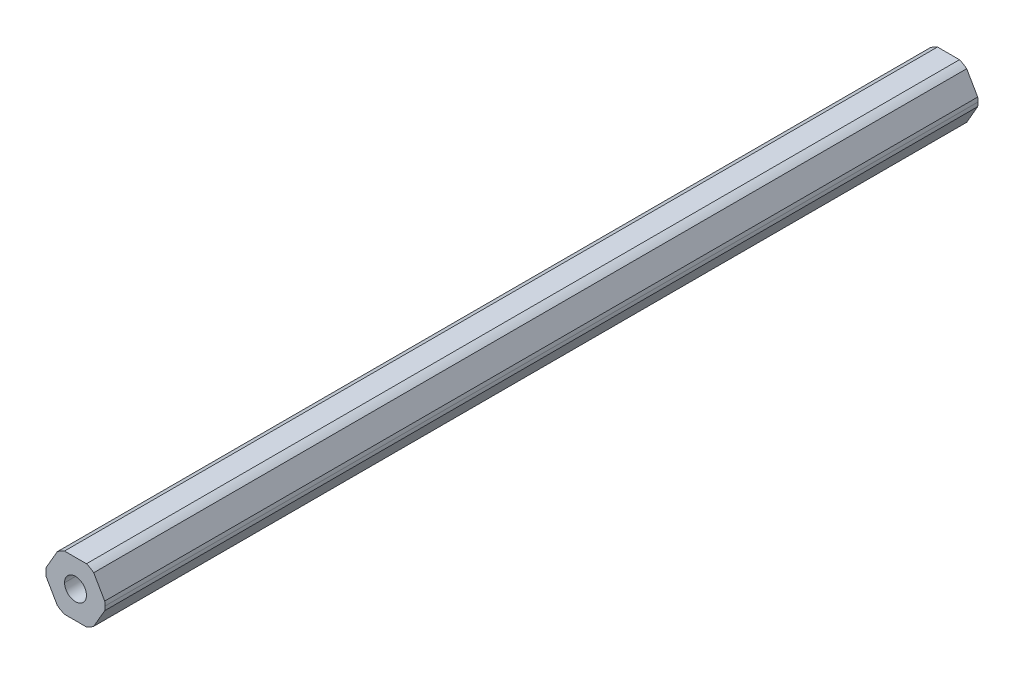
ISO-10303-21;
HEADER;
FILE_DESCRIPTION(('STEP AP214'),'2;1');
FILE_NAME('part.step','',(''),(''),'','','');
FILE_SCHEMA(('AUTOMOTIVE_DESIGN { 1 0 10303 214 1 1 1 1 }'));
ENDSEC;
DATA;
#1=APPLICATION_CONTEXT('core data for automotive mechanical design processes');
#2=APPLICATION_PROTOCOL_DEFINITION('international standard','automotive_design',2000,#1);
#3=PRODUCT_CONTEXT('',#1,'mechanical');
#4=PRODUCT('Part','Part','',(#3));
#5=PRODUCT_RELATED_PRODUCT_CATEGORY('part','',(#4));
#6=PRODUCT_DEFINITION_FORMATION('','',#4);
#7=PRODUCT_DEFINITION_CONTEXT('part definition',#1,'design');
#8=PRODUCT_DEFINITION('design','',#6,#7);
#9=PRODUCT_DEFINITION_SHAPE('','',#8);
#10=(LENGTH_UNIT() NAMED_UNIT(*) SI_UNIT(.MILLI.,.METRE.));
#11=(NAMED_UNIT(*) PLANE_ANGLE_UNIT() SI_UNIT($,.RADIAN.));
#12=(NAMED_UNIT(*) SI_UNIT($,.STERADIAN.) SOLID_ANGLE_UNIT());
#13=UNCERTAINTY_MEASURE_WITH_UNIT(LENGTH_MEASURE(1.E-05),#10,'distance_accuracy_value','');
#14=(GEOMETRIC_REPRESENTATION_CONTEXT(3) GLOBAL_UNCERTAINTY_ASSIGNED_CONTEXT((#13)) GLOBAL_UNIT_ASSIGNED_CONTEXT((#10,
#11,#12)) REPRESENTATION_CONTEXT('',''));
#15=CARTESIAN_POINT('',(0.,0.,0.));
#16=DIRECTION('',(0.,0.,1.));
#17=DIRECTION('',(1.,0.,0.));
#18=AXIS2_PLACEMENT_3D('',#15,#16,#17);
#19=CARTESIAN_POINT('',(0.,0.,-457.2));
#20=DIRECTION('',(0.,0.,1.));
#21=DIRECTION('',(1.,0.,0.));
#22=AXIS2_PLACEMENT_3D('',#19,#20,#21);
#23=CYLINDRICAL_SURFACE('',#22,2.55);
#24=CARTESIAN_POINT('',(0.,0.,-101.6));
#25=DIRECTION('',(0.,0.,-1.));
#26=DIRECTION('',(-1.,0.,0.));
#27=AXIS2_PLACEMENT_3D('',#24,#25,#26);
#28=CIRCLE('',#27,2.55);
#29=CARTESIAN_POINT('',(-2.55,0.,-101.6));
#30=VERTEX_POINT('',#29);
#31=CARTESIAN_POINT('',(2.55,0.,-101.6));
#32=VERTEX_POINT('',#31);
#33=EDGE_CURVE('E77',#30,#32,#28,.F.);
#34=ORIENTED_EDGE('',*,*,#33,.F.);
#35=DIRECTION('',(0.,0.,1.));
#36=VECTOR('',#35,1.);
#37=CARTESIAN_POINT('',(-2.55,0.,-457.2));
#38=LINE('',#37,#36);
#39=CARTESIAN_POINT('',(-2.55,0.,101.6));
#40=VERTEX_POINT('',#39);
#41=EDGE_CURVE('E185',#30,#40,#38,.T.);
#42=ORIENTED_EDGE('',*,*,#41,.T.);
#43=CARTESIAN_POINT('',(0.,0.,101.6));
#44=DIRECTION('',(0.,0.,1.));
#45=DIRECTION('',(1.,0.,0.));
#46=AXIS2_PLACEMENT_3D('',#43,#44,#45);
#47=CIRCLE('',#46,2.55);
#48=CARTESIAN_POINT('',(2.55,0.,101.6));
#49=VERTEX_POINT('',#48);
#50=EDGE_CURVE('E212',#49,#40,#47,.F.);
#51=ORIENTED_EDGE('',*,*,#50,.F.);
#52=DIRECTION('',(0.,0.,1.));
#53=VECTOR('',#52,1.);
#54=CARTESIAN_POINT('',(2.55,0.,-457.2));
#55=LINE('',#54,#53);
#56=EDGE_CURVE('E217',#32,#49,#55,.T.);
#57=ORIENTED_EDGE('',*,*,#56,.F.);
#58=EDGE_LOOP('',(#34,#42,#51,#57));
#59=FACE_BOUND('',#58,.T.);
#60=ADVANCED_FACE('F56',(#59),#23,.F.);
#61=CARTESIAN_POINT('',(0.,0.,-457.2));
#62=DIRECTION('',(0.,0.,1.));
#63=DIRECTION('',(1.,0.,0.));
#64=AXIS2_PLACEMENT_3D('',#61,#62,#63);
#65=CYLINDRICAL_SURFACE('',#64,6.87);
#66=DIRECTION('',(0.,0.,-1.));
#67=VECTOR('',#66,1.);
#68=CARTESIAN_POINT('',(6.80102150534208,-0.971085209378962,-457.2));
#69=LINE('',#68,#67);
#70=CARTESIAN_POINT('',(6.80102150534208,-0.971085209378952,101.6));
#71=VERTEX_POINT('',#70);
#72=CARTESIAN_POINT('',(6.80102150534208,-0.971085209378952,-101.6));
#73=VERTEX_POINT('',#72);
#74=EDGE_CURVE('E179',#71,#73,#69,.T.);
#75=ORIENTED_EDGE('',*,*,#74,.T.);
#76=CARTESIAN_POINT('',(0.,0.,-101.6));
#77=DIRECTION('',(0.,0.,1.));
#78=DIRECTION('',(1.,0.,0.));
#79=AXIS2_PLACEMENT_3D('',#76,#77,#78);
#80=CIRCLE('',#79,6.87);
#81=CARTESIAN_POINT('',(6.87,0.,-101.6));
#82=VERTEX_POINT('',#81);
#83=EDGE_CURVE('E163',#73,#82,#80,.T.);
#84=ORIENTED_EDGE('',*,*,#83,.T.);
#85=DIRECTION('',(0.,0.,1.));
#86=VECTOR('',#85,1.);
#87=CARTESIAN_POINT('',(6.87,0.,-457.2));
#88=LINE('',#87,#86);
#89=CARTESIAN_POINT('',(6.87,0.,101.6));
#90=VERTEX_POINT('',#89);
#91=EDGE_CURVE('E176',#82,#90,#88,.T.);
#92=ORIENTED_EDGE('',*,*,#91,.T.);
#93=CARTESIAN_POINT('',(0.,0.,101.6));
#94=DIRECTION('',(0.,0.,1.));
#95=DIRECTION('',(1.,0.,0.));
#96=AXIS2_PLACEMENT_3D('',#93,#94,#95);
#97=CIRCLE('',#96,6.87);
#98=EDGE_CURVE('E224',#71,#90,#97,.T.);
#99=ORIENTED_EDGE('',*,*,#98,.F.);
#100=EDGE_LOOP('',(#75,#84,#92,#99));
#101=FACE_BOUND('',#100,.T.);
#102=ADVANCED_FACE('F174',(#101),#65,.T.);
#103=CARTESIAN_POINT('',(3.68083890619154,-6.3754,457.2));
#104=DIRECTION('',(-0.866025403784439,0.5,0.));
#105=DIRECTION('',(0.,0.,1.));
#106=AXIS2_PLACEMENT_3D('',#103,#104,#105);
#107=PLANE('',#106);
#108=DIRECTION('',(-0.5,-0.866025403784439,0.));
#109=VECTOR('',#108,1.);
#110=CARTESIAN_POINT('',(3.68083890619154,-6.3754,-101.6));
#111=LINE('',#110,#109);
#112=CARTESIAN_POINT('',(4.24149521323255,-5.40431479062104,-101.6));
#113=VERTEX_POINT('',#112);
#114=EDGE_CURVE('E273',#73,#113,#111,.T.);
#115=ORIENTED_EDGE('',*,*,#114,.F.);
#116=ORIENTED_EDGE('',*,*,#74,.F.);
#117=DIRECTION('',(0.5,0.866025403784439,0.));
#118=VECTOR('',#117,1.);
#119=CARTESIAN_POINT('',(3.68083890619154,-6.3754,101.6));
#120=LINE('',#119,#118);
#121=CARTESIAN_POINT('',(4.24149521323254,-5.40431479062105,101.6));
#122=VERTEX_POINT('',#121);
#123=EDGE_CURVE('E234',#122,#71,#120,.T.);
#124=ORIENTED_EDGE('',*,*,#123,.F.);
#125=DIRECTION('',(0.,0.,1.));
#126=VECTOR('',#125,1.);
#127=CARTESIAN_POINT('',(4.24149521323255,-5.40431479062104,-457.2));
#128=LINE('',#127,#126);
#129=EDGE_CURVE('E241',#113,#122,#128,.T.);
#130=ORIENTED_EDGE('',*,*,#129,.F.);
#131=EDGE_LOOP('',(#115,#116,#124,#130));
#132=FACE_BOUND('',#131,.T.);
#133=ADVANCED_FACE('F325',(#132),#107,.F.);
#134=CARTESIAN_POINT('',(7.36167781238308,0.,457.2));
#135=DIRECTION('',(-0.866025403784439,-0.5,0.));
#136=DIRECTION('',(-0.5,0.866025403784439,0.));
#137=AXIS2_PLACEMENT_3D('',#134,#135,#136);
#138=PLANE('',#137);
#139=DIRECTION('',(0.5,-0.866025403784439,0.));
#140=VECTOR('',#139,1.);
#141=CARTESIAN_POINT('',(7.36167781238308,0.,-101.6));
#142=LINE('',#141,#140);
#143=CARTESIAN_POINT('',(4.24149521323254,5.40431479062105,-101.6));
#144=VERTEX_POINT('',#143);
#145=CARTESIAN_POINT('',(6.80102150534208,0.971085209378949,-101.6));
#146=VERTEX_POINT('',#145);
#147=EDGE_CURVE('E166',#144,#146,#142,.T.);
#148=ORIENTED_EDGE('',*,*,#147,.F.);
#149=DIRECTION('',(0.,0.,-1.));
#150=VECTOR('',#149,1.);
#151=CARTESIAN_POINT('',(4.24149521323254,5.40431479062105,-457.2));
#152=LINE('',#151,#150);
#153=CARTESIAN_POINT('',(4.24149521323254,5.40431479062105,101.6));
#154=VERTEX_POINT('',#153);
#155=EDGE_CURVE('E194',#154,#144,#152,.T.);
#156=ORIENTED_EDGE('',*,*,#155,.F.);
#157=DIRECTION('',(-0.5,0.866025403784439,0.));
#158=VECTOR('',#157,1.);
#159=CARTESIAN_POINT('',(7.36167781238308,0.,101.6));
#160=LINE('',#159,#158);
#161=CARTESIAN_POINT('',(6.80102150534208,0.97108520937895,101.6));
#162=VERTEX_POINT('',#161);
#163=EDGE_CURVE('E232',#162,#154,#160,.T.);
#164=ORIENTED_EDGE('',*,*,#163,.F.);
#165=DIRECTION('',(0.,0.,1.));
#166=VECTOR('',#165,1.);
#167=CARTESIAN_POINT('',(6.80102150534208,0.971085209378949,-457.2));
#168=LINE('',#167,#166);
#169=EDGE_CURVE('E188',#146,#162,#168,.T.);
#170=ORIENTED_EDGE('',*,*,#169,.F.);
#171=EDGE_LOOP('',(#148,#156,#164,#170));
#172=FACE_BOUND('',#171,.T.);
#173=ADVANCED_FACE('F334',(#172),#138,.F.);
#174=CARTESIAN_POINT('',(3.68083890619154,6.3754,457.2));
#175=DIRECTION('',(0.,-1.,0.));
#176=DIRECTION('',(0.,0.,-1.));
#177=AXIS2_PLACEMENT_3D('',#174,#175,#176);
#178=PLANE('',#177);
#179=DIRECTION('',(1.,0.,0.));
#180=VECTOR('',#179,1.);
#181=CARTESIAN_POINT('',(3.68083890619154,6.3754,-101.6));
#182=LINE('',#181,#180);
#183=CARTESIAN_POINT('',(-2.55952629210953,6.3754,-101.6));
#184=VERTEX_POINT('',#183);
#185=CARTESIAN_POINT('',(2.55952629210952,6.3754,-101.6));
#186=VERTEX_POINT('',#185);
#187=EDGE_CURVE('E71',#184,#186,#182,.T.);
#188=ORIENTED_EDGE('',*,*,#187,.F.);
#189=DIRECTION('',(0.,0.,-1.));
#190=VECTOR('',#189,1.);
#191=CARTESIAN_POINT('',(-2.55952629210953,6.3754,-457.2));
#192=LINE('',#191,#190);
#193=CARTESIAN_POINT('',(-2.55952629210953,6.3754,101.6));
#194=VERTEX_POINT('',#193);
#195=EDGE_CURVE('E204',#194,#184,#192,.T.);
#196=ORIENTED_EDGE('',*,*,#195,.F.);
#197=DIRECTION('',(-1.,0.,0.));
#198=VECTOR('',#197,1.);
#199=CARTESIAN_POINT('',(3.68083890619154,6.3754,101.6));
#200=LINE('',#199,#198);
#201=CARTESIAN_POINT('',(2.55952629210953,6.3754,101.6));
#202=VERTEX_POINT('',#201);
#203=EDGE_CURVE('E230',#202,#194,#200,.T.);
#204=ORIENTED_EDGE('',*,*,#203,.F.);
#205=DIRECTION('',(0.,0.,1.));
#206=VECTOR('',#205,1.);
#207=CARTESIAN_POINT('',(2.55952629210952,6.3754,-457.2));
#208=LINE('',#207,#206);
#209=EDGE_CURVE('E198',#186,#202,#208,.T.);
#210=ORIENTED_EDGE('',*,*,#209,.F.);
#211=EDGE_LOOP('',(#188,#196,#204,#210));
#212=FACE_BOUND('',#211,.T.);
#213=ADVANCED_FACE('F299',(#212),#178,.F.);
#214=CARTESIAN_POINT('',(-3.68083890619154,6.3754,457.2));
#215=DIRECTION('',(0.866025403784439,-0.5,0.));
#216=DIRECTION('',(0.,0.,-1.));
#217=AXIS2_PLACEMENT_3D('',#214,#215,#216);
#218=PLANE('',#217);
#219=DIRECTION('',(0.5,0.866025403784439,0.));
#220=VECTOR('',#219,1.);
#221=CARTESIAN_POINT('',(-3.68083890619154,6.3754,-101.6));
#222=LINE('',#221,#220);
#223=CARTESIAN_POINT('',(-6.80102150534208,0.971085209378959,-101.6));
#224=VERTEX_POINT('',#223);
#225=CARTESIAN_POINT('',(-4.24149521323254,5.40431479062104,-101.6));
#226=VERTEX_POINT('',#225);
#227=EDGE_CURVE('E277',#224,#226,#222,.T.);
#228=ORIENTED_EDGE('',*,*,#227,.F.);
#229=DIRECTION('',(0.,0.,-1.));
#230=VECTOR('',#229,1.);
#231=CARTESIAN_POINT('',(-6.80102150534208,0.97108520937896,-457.2));
#232=LINE('',#231,#230);
#233=CARTESIAN_POINT('',(-6.80102150534208,0.971085209378959,101.6));
#234=VERTEX_POINT('',#233);
#235=EDGE_CURVE('E199',#234,#224,#232,.T.);
#236=ORIENTED_EDGE('',*,*,#235,.F.);
#237=DIRECTION('',(-0.5,-0.866025403784439,0.));
#238=VECTOR('',#237,1.);
#239=CARTESIAN_POINT('',(-3.68083890619154,6.3754,101.6));
#240=LINE('',#239,#238);
#241=CARTESIAN_POINT('',(-4.24149521323254,5.40431479062104,101.6));
#242=VERTEX_POINT('',#241);
#243=EDGE_CURVE('E228',#242,#234,#240,.T.);
#244=ORIENTED_EDGE('',*,*,#243,.F.);
#245=DIRECTION('',(0.,0.,1.));
#246=VECTOR('',#245,1.);
#247=CARTESIAN_POINT('',(-4.24149521323255,5.40431479062105,-457.2));
#248=LINE('',#247,#246);
#249=EDGE_CURVE('E197',#226,#242,#248,.T.);
#250=ORIENTED_EDGE('',*,*,#249,.F.);
#251=EDGE_LOOP('',(#228,#236,#244,#250));
#252=FACE_BOUND('',#251,.T.);
#253=ADVANCED_FACE('F311',(#252),#218,.F.);
#254=CARTESIAN_POINT('',(-7.36167781238308,0.,457.2));
#255=DIRECTION('',(0.866025403784439,0.5,0.));
#256=DIRECTION('',(0.,0.,-1.));
#257=AXIS2_PLACEMENT_3D('',#254,#255,#256);
#258=PLANE('',#257);
#259=DIRECTION('',(-0.5,0.866025403784439,0.));
#260=VECTOR('',#259,1.);
#261=CARTESIAN_POINT('',(-7.36167781238308,0.,-101.6));
#262=LINE('',#261,#260);
#263=CARTESIAN_POINT('',(-4.24149521323255,-5.40431479062104,-101.6));
#264=VERTEX_POINT('',#263);
#265=CARTESIAN_POINT('',(-6.80102150534208,-0.971085209378958,-101.6));
#266=VERTEX_POINT('',#265);
#267=EDGE_CURVE('E279',#264,#266,#262,.T.);
#268=ORIENTED_EDGE('',*,*,#267,.F.);
#269=DIRECTION('',(0.,0.,-1.));
#270=VECTOR('',#269,1.);
#271=CARTESIAN_POINT('',(-4.24149521323255,-5.40431479062104,-457.2));
#272=LINE('',#271,#270);
#273=CARTESIAN_POINT('',(-4.24149521323254,-5.40431479062105,101.6));
#274=VERTEX_POINT('',#273);
#275=EDGE_CURVE('E237',#274,#264,#272,.T.);
#276=ORIENTED_EDGE('',*,*,#275,.F.);
#277=DIRECTION('',(0.5,-0.866025403784439,0.));
#278=VECTOR('',#277,1.);
#279=CARTESIAN_POINT('',(-7.36167781238308,0.,101.6));
#280=LINE('',#279,#278);
#281=CARTESIAN_POINT('',(-6.80102150534208,-0.971085209378956,101.6));
#282=VERTEX_POINT('',#281);
#283=EDGE_CURVE('E220',#282,#274,#280,.T.);
#284=ORIENTED_EDGE('',*,*,#283,.F.);
#285=DIRECTION('',(0.,0.,1.));
#286=VECTOR('',#285,1.);
#287=CARTESIAN_POINT('',(-6.80102150534208,-0.971085209378962,-457.2));
#288=LINE('',#287,#286);
#289=EDGE_CURVE('E203',#266,#282,#288,.T.);
#290=ORIENTED_EDGE('',*,*,#289,.F.);
#291=EDGE_LOOP('',(#268,#276,#284,#290));
#292=FACE_BOUND('',#291,.T.);
#293=ADVANCED_FACE('F308',(#292),#258,.F.);
#294=CARTESIAN_POINT('',(-3.68083890619154,-6.3754,457.2));
#295=DIRECTION('',(0.,1.,0.));
#296=DIRECTION('',(1.,0.,0.));
#297=AXIS2_PLACEMENT_3D('',#294,#295,#296);
#298=PLANE('',#297);
#299=DIRECTION('',(-1.,0.,0.));
#300=VECTOR('',#299,1.);
#301=CARTESIAN_POINT('',(-3.68083890619154,-6.3754,-101.6));
#302=LINE('',#301,#300);
#303=CARTESIAN_POINT('',(2.55952629210953,-6.3754,-101.6));
#304=VERTEX_POINT('',#303);
#305=CARTESIAN_POINT('',(-2.55952629210953,-6.3754,-101.6));
#306=VERTEX_POINT('',#305);
#307=EDGE_CURVE('E267',#304,#306,#302,.T.);
#308=ORIENTED_EDGE('',*,*,#307,.F.);
#309=DIRECTION('',(0.,0.,-1.));
#310=VECTOR('',#309,1.);
#311=CARTESIAN_POINT('',(2.55952629210953,-6.3754,-457.2));
#312=LINE('',#311,#310);
#313=CARTESIAN_POINT('',(2.55952629210953,-6.3754,101.6));
#314=VERTEX_POINT('',#313);
#315=EDGE_CURVE('E192',#314,#304,#312,.T.);
#316=ORIENTED_EDGE('',*,*,#315,.F.);
#317=DIRECTION('',(1.,0.,0.));
#318=VECTOR('',#317,1.);
#319=CARTESIAN_POINT('',(-3.68083890619154,-6.3754,101.6));
#320=LINE('',#319,#318);
#321=CARTESIAN_POINT('',(-2.55952629210953,-6.3754,101.6));
#322=VERTEX_POINT('',#321);
#323=EDGE_CURVE('E218',#322,#314,#320,.T.);
#324=ORIENTED_EDGE('',*,*,#323,.F.);
#325=DIRECTION('',(0.,0.,1.));
#326=VECTOR('',#325,1.);
#327=CARTESIAN_POINT('',(-2.55952629210953,-6.3754,-457.2));
#328=LINE('',#327,#326);
#329=EDGE_CURVE('E202',#306,#322,#328,.T.);
#330=ORIENTED_EDGE('',*,*,#329,.F.);
#331=EDGE_LOOP('',(#308,#316,#324,#330));
#332=FACE_BOUND('',#331,.T.);
#333=ADVANCED_FACE('F265',(#332),#298,.F.);
#334=CARTESIAN_POINT('',(0.,0.,-457.2));
#335=DIRECTION('',(0.,0.,1.));
#336=DIRECTION('',(1.,0.,0.));
#337=AXIS2_PLACEMENT_3D('',#334,#335,#336);
#338=CYLINDRICAL_SURFACE('',#337,6.87);
#339=ORIENTED_EDGE('',*,*,#91,.F.);
#340=EDGE_CURVE('E160',#82,#146,#80,.T.);
#341=ORIENTED_EDGE('',*,*,#340,.T.);
#342=ORIENTED_EDGE('',*,*,#169,.T.);
#343=EDGE_CURVE('E184',#90,#162,#97,.T.);
#344=ORIENTED_EDGE('',*,*,#343,.F.);
#345=EDGE_LOOP('',(#339,#341,#342,#344));
#346=FACE_BOUND('',#345,.T.);
#347=ADVANCED_FACE('F182',(#346),#338,.T.);
#348=CARTESIAN_POINT('',(0.,0.,-457.2));
#349=DIRECTION('',(0.,0.,1.));
#350=DIRECTION('',(1.,0.,0.));
#351=AXIS2_PLACEMENT_3D('',#348,#349,#350);
#352=CYLINDRICAL_SURFACE('',#351,6.87);
#353=ORIENTED_EDGE('',*,*,#315,.T.);
#354=EDGE_CURVE('E180',#304,#113,#80,.T.);
#355=ORIENTED_EDGE('',*,*,#354,.T.);
#356=ORIENTED_EDGE('',*,*,#129,.T.);
#357=EDGE_CURVE('E263',#314,#122,#97,.T.);
#358=ORIENTED_EDGE('',*,*,#357,.F.);
#359=EDGE_LOOP('',(#353,#355,#356,#358));
#360=FACE_BOUND('',#359,.T.);
#361=ADVANCED_FACE('F270',(#360),#352,.T.);
#362=CARTESIAN_POINT('',(0.,0.,-457.2));
#363=DIRECTION('',(0.,0.,1.));
#364=DIRECTION('',(1.,0.,0.));
#365=AXIS2_PLACEMENT_3D('',#362,#363,#364);
#366=CYLINDRICAL_SURFACE('',#365,6.87);
#367=ORIENTED_EDGE('',*,*,#275,.T.);
#368=EDGE_CURVE('E254',#264,#306,#80,.T.);
#369=ORIENTED_EDGE('',*,*,#368,.T.);
#370=ORIENTED_EDGE('',*,*,#329,.T.);
#371=EDGE_CURVE('E252',#274,#322,#97,.T.);
#372=ORIENTED_EDGE('',*,*,#371,.F.);
#373=EDGE_LOOP('',(#367,#369,#370,#372));
#374=FACE_BOUND('',#373,.T.);
#375=ADVANCED_FACE('F251',(#374),#366,.T.);
#376=CARTESIAN_POINT('',(0.,0.,-457.2));
#377=DIRECTION('',(0.,0.,1.));
#378=DIRECTION('',(1.,0.,0.));
#379=AXIS2_PLACEMENT_3D('',#376,#377,#378);
#380=CYLINDRICAL_SURFACE('',#379,6.87);
#381=ORIENTED_EDGE('',*,*,#235,.T.);
#382=EDGE_CURVE('E283',#224,#266,#80,.T.);
#383=ORIENTED_EDGE('',*,*,#382,.T.);
#384=ORIENTED_EDGE('',*,*,#289,.T.);
#385=EDGE_CURVE('E262',#234,#282,#97,.T.);
#386=ORIENTED_EDGE('',*,*,#385,.F.);
#387=EDGE_LOOP('',(#381,#383,#384,#386));
#388=FACE_BOUND('',#387,.T.);
#389=ADVANCED_FACE('F312',(#388),#380,.T.);
#390=CARTESIAN_POINT('',(0.,0.,-457.2));
#391=DIRECTION('',(0.,0.,1.));
#392=DIRECTION('',(1.,0.,0.));
#393=AXIS2_PLACEMENT_3D('',#390,#391,#392);
#394=CYLINDRICAL_SURFACE('',#393,6.87);
#395=ORIENTED_EDGE('',*,*,#195,.T.);
#396=EDGE_CURVE('E285',#184,#226,#80,.T.);
#397=ORIENTED_EDGE('',*,*,#396,.T.);
#398=ORIENTED_EDGE('',*,*,#249,.T.);
#399=EDGE_CURVE('E303',#194,#242,#97,.T.);
#400=ORIENTED_EDGE('',*,*,#399,.F.);
#401=EDGE_LOOP('',(#395,#397,#398,#400));
#402=FACE_BOUND('',#401,.T.);
#403=ADVANCED_FACE('F58',(#402),#394,.T.);
#404=CARTESIAN_POINT('',(0.,0.,-457.2));
#405=DIRECTION('',(0.,0.,1.));
#406=DIRECTION('',(1.,0.,0.));
#407=AXIS2_PLACEMENT_3D('',#404,#405,#406);
#408=CYLINDRICAL_SURFACE('',#407,6.87);
#409=ORIENTED_EDGE('',*,*,#155,.T.);
#410=EDGE_CURVE('E170',#144,#186,#80,.T.);
#411=ORIENTED_EDGE('',*,*,#410,.T.);
#412=ORIENTED_EDGE('',*,*,#209,.T.);
#413=EDGE_CURVE('E222',#154,#202,#97,.T.);
#414=ORIENTED_EDGE('',*,*,#413,.F.);
#415=EDGE_LOOP('',(#409,#411,#412,#414));
#416=FACE_BOUND('',#415,.T.);
#417=ADVANCED_FACE('F293',(#416),#408,.T.);
#418=CARTESIAN_POINT('',(0.,0.,-457.2));
#419=DIRECTION('',(0.,0.,1.));
#420=DIRECTION('',(1.,0.,0.));
#421=AXIS2_PLACEMENT_3D('',#418,#419,#420);
#422=CYLINDRICAL_SURFACE('',#421,2.55);
#423=CARTESIAN_POINT('',(0.,0.,-101.6));
#424=DIRECTION('',(0.,0.,-1.));
#425=DIRECTION('',(-1.,0.,0.));
#426=AXIS2_PLACEMENT_3D('',#423,#424,#425);
#427=CIRCLE('',#426,2.55);
#428=EDGE_CURVE('E13',#32,#30,#427,.F.);
#429=ORIENTED_EDGE('',*,*,#428,.F.);
#430=ORIENTED_EDGE('',*,*,#56,.T.);
#431=CARTESIAN_POINT('',(0.,0.,101.6));
#432=DIRECTION('',(0.,0.,1.));
#433=DIRECTION('',(1.,0.,0.));
#434=AXIS2_PLACEMENT_3D('',#431,#432,#433);
#435=CIRCLE('',#434,2.55);
#436=EDGE_CURVE('E64',#40,#49,#435,.F.);
#437=ORIENTED_EDGE('',*,*,#436,.F.);
#438=ORIENTED_EDGE('',*,*,#41,.F.);
#439=EDGE_LOOP('',(#429,#430,#437,#438));
#440=FACE_BOUND('',#439,.T.);
#441=ADVANCED_FACE('F329',(#440),#422,.F.);
#442=CARTESIAN_POINT('',(0.,0.,101.6));
#443=DIRECTION('',(0.,0.,1.));
#444=DIRECTION('',(1.,0.,0.));
#445=AXIS2_PLACEMENT_3D('',#442,#443,#444);
#446=PLANE('',#445);
#447=ORIENTED_EDGE('',*,*,#50,.T.);
#448=ORIENTED_EDGE('',*,*,#436,.T.);
#449=EDGE_LOOP('',(#447,#448));
#450=FACE_BOUND('',#449,.T.);
#451=ORIENTED_EDGE('',*,*,#123,.T.);
#452=ORIENTED_EDGE('',*,*,#98,.T.);
#453=ORIENTED_EDGE('',*,*,#343,.T.);
#454=ORIENTED_EDGE('',*,*,#163,.T.);
#455=ORIENTED_EDGE('',*,*,#413,.T.);
#456=ORIENTED_EDGE('',*,*,#203,.T.);
#457=ORIENTED_EDGE('',*,*,#399,.T.);
#458=ORIENTED_EDGE('',*,*,#243,.T.);
#459=ORIENTED_EDGE('',*,*,#385,.T.);
#460=ORIENTED_EDGE('',*,*,#283,.T.);
#461=ORIENTED_EDGE('',*,*,#371,.T.);
#462=ORIENTED_EDGE('',*,*,#323,.T.);
#463=ORIENTED_EDGE('',*,*,#357,.T.);
#464=EDGE_LOOP('',(#451,#452,#453,#454,#455,#456,#457,#458,#459,#460,#461,#462,#463));
#465=FACE_BOUND('',#464,.T.);
#466=ADVANCED_FACE('F210',(#450,#465),#446,.T.);
#467=CARTESIAN_POINT('',(0.,0.,-101.6));
#468=DIRECTION('',(0.,0.,-1.));
#469=DIRECTION('',(1.,0.,0.));
#470=AXIS2_PLACEMENT_3D('',#467,#468,#469);
#471=PLANE('',#470);
#472=ORIENTED_EDGE('',*,*,#33,.T.);
#473=ORIENTED_EDGE('',*,*,#428,.T.);
#474=EDGE_LOOP('',(#472,#473));
#475=FACE_BOUND('',#474,.T.);
#476=ORIENTED_EDGE('',*,*,#114,.T.);
#477=ORIENTED_EDGE('',*,*,#354,.F.);
#478=ORIENTED_EDGE('',*,*,#307,.T.);
#479=ORIENTED_EDGE('',*,*,#368,.F.);
#480=ORIENTED_EDGE('',*,*,#267,.T.);
#481=ORIENTED_EDGE('',*,*,#382,.F.);
#482=ORIENTED_EDGE('',*,*,#227,.T.);
#483=ORIENTED_EDGE('',*,*,#396,.F.);
#484=ORIENTED_EDGE('',*,*,#187,.T.);
#485=ORIENTED_EDGE('',*,*,#410,.F.);
#486=ORIENTED_EDGE('',*,*,#147,.T.);
#487=ORIENTED_EDGE('',*,*,#340,.F.);
#488=ORIENTED_EDGE('',*,*,#83,.F.);
#489=EDGE_LOOP('',(#476,#477,#478,#479,#480,#481,#482,#483,#484,#485,#486,#487,#488));
#490=FACE_BOUND('',#489,.T.);
#491=ADVANCED_FACE('F162',(#475,#490),#471,.T.);
#492=CLOSED_SHELL('',(#60,#102,#133,#173,#213,#253,#293,#333,#347,#361,#375,#389,#403,#417,#441,
#466,#491));
#493=MANIFOLD_SOLID_BREP('B2',#492);
#494=ADVANCED_BREP_SHAPE_REPRESENTATION('',(#18,#493),#14);
#495=SHAPE_DEFINITION_REPRESENTATION(#9,#494);
ENDSEC;
END-ISO-10303-21;
